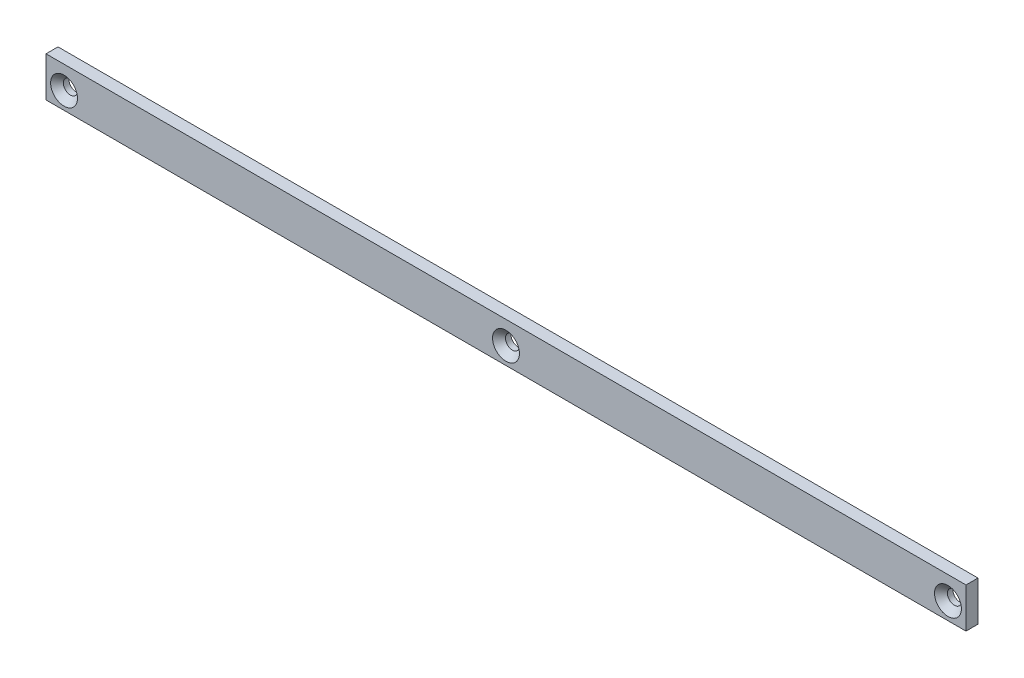
ISO-10303-21;
HEADER;
FILE_DESCRIPTION(('STEP AP214'),'2;1');
FILE_NAME('part.step','',(''),(''),'','','');
FILE_SCHEMA(('AUTOMOTIVE_DESIGN { 1 0 10303 214 1 1 1 1 }'));
ENDSEC;
DATA;
#1=APPLICATION_CONTEXT('core data for automotive mechanical design processes');
#2=APPLICATION_PROTOCOL_DEFINITION('international standard','automotive_design',2000,#1);
#3=PRODUCT_CONTEXT('',#1,'mechanical');
#4=PRODUCT('Part','Part','',(#3));
#5=PRODUCT_RELATED_PRODUCT_CATEGORY('part','',(#4));
#6=PRODUCT_DEFINITION_FORMATION('','',#4);
#7=PRODUCT_DEFINITION_CONTEXT('part definition',#1,'design');
#8=PRODUCT_DEFINITION('design','',#6,#7);
#9=PRODUCT_DEFINITION_SHAPE('','',#8);
#10=(LENGTH_UNIT() NAMED_UNIT(*) SI_UNIT(.MILLI.,.METRE.));
#11=(NAMED_UNIT(*) PLANE_ANGLE_UNIT() SI_UNIT($,.RADIAN.));
#12=(NAMED_UNIT(*) SI_UNIT($,.STERADIAN.) SOLID_ANGLE_UNIT());
#13=UNCERTAINTY_MEASURE_WITH_UNIT(LENGTH_MEASURE(1.E-05),#10,'distance_accuracy_value','');
#14=(GEOMETRIC_REPRESENTATION_CONTEXT(3) GLOBAL_UNCERTAINTY_ASSIGNED_CONTEXT((#13)) GLOBAL_UNIT_ASSIGNED_CONTEXT((#10,
#11,#12)) REPRESENTATION_CONTEXT('',''));
#15=CARTESIAN_POINT('',(0.,0.,0.));
#16=DIRECTION('',(0.,0.,1.));
#17=DIRECTION('',(1.,0.,0.));
#18=AXIS2_PLACEMENT_3D('',#15,#16,#17);
#19=CARTESIAN_POINT('',(0.,0.,3.));
#20=DIRECTION('',(0.,0.,1.));
#21=DIRECTION('',(1.,0.,0.));
#22=AXIS2_PLACEMENT_3D('',#19,#20,#21);
#23=PLANE('',#22);
#24=CARTESIAN_POINT('',(-110.490700250828,4.27927680731129,3.));
#25=DIRECTION('',(0.,0.,1.));
#26=DIRECTION('',(1.,0.,0.));
#27=AXIS2_PLACEMENT_3D('',#24,#25,#26);
#28=CIRCLE('',#27,3.36);
#29=CARTESIAN_POINT('',(-107.130700250828,4.27927680731129,3.));
#30=VERTEX_POINT('',#29);
#31=EDGE_CURVE('E192',#30,#30,#28,.T.);
#32=ORIENTED_EDGE('',*,*,#31,.F.);
#33=EDGE_LOOP('',(#32));
#34=FACE_BOUND('',#33,.T.);
#35=CARTESIAN_POINT('',(0.,4.27927680731129,3.));
#36=DIRECTION('',(0.,0.,1.));
#37=DIRECTION('',(1.,0.,0.));
#38=AXIS2_PLACEMENT_3D('',#35,#36,#37);
#39=CIRCLE('',#38,3.36);
#40=CARTESIAN_POINT('',(3.36,4.27927680731129,3.));
#41=VERTEX_POINT('',#40);
#42=EDGE_CURVE('E179',#41,#41,#39,.T.);
#43=ORIENTED_EDGE('',*,*,#42,.F.);
#44=EDGE_LOOP('',(#43));
#45=FACE_BOUND('',#44,.T.);
#46=CARTESIAN_POINT('',(110.490700250828,4.27927680731129,3.));
#47=DIRECTION('',(0.,0.,1.));
#48=DIRECTION('',(1.,0.,0.));
#49=AXIS2_PLACEMENT_3D('',#46,#47,#48);
#50=CIRCLE('',#49,3.36);
#51=CARTESIAN_POINT('',(113.850700250828,4.27927680731129,3.));
#52=VERTEX_POINT('',#51);
#53=EDGE_CURVE('E175',#52,#52,#50,.T.);
#54=ORIENTED_EDGE('',*,*,#53,.F.);
#55=EDGE_LOOP('',(#54));
#56=FACE_BOUND('',#55,.T.);
#57=DIRECTION('',(0.,1.,0.));
#58=VECTOR('',#57,1.);
#59=CARTESIAN_POINT('',(115.,0.,3.));
#60=LINE('',#59,#58);
#61=CARTESIAN_POINT('',(115.,0.,3.));
#62=VERTEX_POINT('',#61);
#63=CARTESIAN_POINT('',(115.,10.,3.));
#64=VERTEX_POINT('',#63);
#65=EDGE_CURVE('E135',#62,#64,#60,.T.);
#66=ORIENTED_EDGE('',*,*,#65,.T.);
#67=DIRECTION('',(-1.,0.,0.));
#68=VECTOR('',#67,1.);
#69=CARTESIAN_POINT('',(115.,10.,3.));
#70=LINE('',#69,#68);
#71=CARTESIAN_POINT('',(-115.,10.,3.));
#72=VERTEX_POINT('',#71);
#73=EDGE_CURVE('E128',#64,#72,#70,.T.);
#74=ORIENTED_EDGE('',*,*,#73,.T.);
#75=DIRECTION('',(0.,1.,0.));
#76=VECTOR('',#75,1.);
#77=CARTESIAN_POINT('',(-115.,0.,3.));
#78=LINE('',#77,#76);
#79=CARTESIAN_POINT('',(-115.,0.,3.));
#80=VERTEX_POINT('',#79);
#81=EDGE_CURVE('E134',#80,#72,#78,.T.);
#82=ORIENTED_EDGE('',*,*,#81,.F.);
#83=DIRECTION('',(-1.,0.,0.));
#84=VECTOR('',#83,1.);
#85=CARTESIAN_POINT('',(115.,0.,3.));
#86=LINE('',#85,#84);
#87=EDGE_CURVE('E148',#62,#80,#86,.T.);
#88=ORIENTED_EDGE('',*,*,#87,.F.);
#89=EDGE_LOOP('',(#66,#74,#82,#88));
#90=FACE_BOUND('',#89,.T.);
#91=ADVANCED_FACE('F83',(#34,#45,#56,#90),#23,.T.);
#92=CARTESIAN_POINT('',(0.,0.,0.));
#93=DIRECTION('',(0.,0.,1.));
#94=DIRECTION('',(1.,0.,0.));
#95=AXIS2_PLACEMENT_3D('',#92,#93,#94);
#96=PLANE('',#95);
#97=DIRECTION('',(0.,1.,0.));
#98=VECTOR('',#97,1.);
#99=CARTESIAN_POINT('',(115.,0.,0.));
#100=LINE('',#99,#98);
#101=CARTESIAN_POINT('',(115.,0.,0.));
#102=VERTEX_POINT('',#101);
#103=CARTESIAN_POINT('',(115.,10.,0.));
#104=VERTEX_POINT('',#103);
#105=EDGE_CURVE('E154',#102,#104,#100,.T.);
#106=ORIENTED_EDGE('',*,*,#105,.F.);
#107=DIRECTION('',(-1.,0.,0.));
#108=VECTOR('',#107,1.);
#109=CARTESIAN_POINT('',(115.,0.,0.));
#110=LINE('',#109,#108);
#111=CARTESIAN_POINT('',(-115.,0.,0.));
#112=VERTEX_POINT('',#111);
#113=EDGE_CURVE('E163',#102,#112,#110,.T.);
#114=ORIENTED_EDGE('',*,*,#113,.T.);
#115=DIRECTION('',(0.,1.,0.));
#116=VECTOR('',#115,1.);
#117=CARTESIAN_POINT('',(-115.,0.,0.));
#118=LINE('',#117,#116);
#119=CARTESIAN_POINT('',(-115.,10.,0.));
#120=VERTEX_POINT('',#119);
#121=EDGE_CURVE('E160',#112,#120,#118,.T.);
#122=ORIENTED_EDGE('',*,*,#121,.T.);
#123=DIRECTION('',(-1.,0.,0.));
#124=VECTOR('',#123,1.);
#125=CARTESIAN_POINT('',(115.,10.,0.));
#126=LINE('',#125,#124);
#127=EDGE_CURVE('E141',#104,#120,#126,.T.);
#128=ORIENTED_EDGE('',*,*,#127,.F.);
#129=EDGE_LOOP('',(#106,#114,#122,#128));
#130=FACE_BOUND('',#129,.T.);
#131=CARTESIAN_POINT('',(110.490700250828,4.27927680731129,0.));
#132=DIRECTION('',(0.,0.,1.));
#133=DIRECTION('',(1.,0.,0.));
#134=AXIS2_PLACEMENT_3D('',#131,#132,#133);
#135=CIRCLE('',#134,1.75);
#136=CARTESIAN_POINT('',(112.240700250828,4.27927680731129,0.));
#137=VERTEX_POINT('',#136);
#138=EDGE_CURVE('E157',#137,#137,#135,.T.);
#139=ORIENTED_EDGE('',*,*,#138,.T.);
#140=EDGE_LOOP('',(#139));
#141=FACE_BOUND('',#140,.T.);
#142=CARTESIAN_POINT('',(0.,4.27927680731129,0.));
#143=DIRECTION('',(0.,0.,1.));
#144=DIRECTION('',(1.,0.,0.));
#145=AXIS2_PLACEMENT_3D('',#142,#143,#144);
#146=CIRCLE('',#145,1.75);
#147=CARTESIAN_POINT('',(1.75,4.27927680731129,0.));
#148=VERTEX_POINT('',#147);
#149=EDGE_CURVE('E198',#148,#148,#146,.T.);
#150=ORIENTED_EDGE('',*,*,#149,.T.);
#151=EDGE_LOOP('',(#150));
#152=FACE_BOUND('',#151,.T.);
#153=CARTESIAN_POINT('',(-110.490700250828,4.27927680731129,0.));
#154=DIRECTION('',(0.,0.,1.));
#155=DIRECTION('',(1.,0.,0.));
#156=AXIS2_PLACEMENT_3D('',#153,#154,#155);
#157=CIRCLE('',#156,1.76884275115743);
#158=CARTESIAN_POINT('',(-108.72185749967,4.27927680731129,0.));
#159=VERTEX_POINT('',#158);
#160=EDGE_CURVE('E174',#159,#159,#157,.T.);
#161=ORIENTED_EDGE('',*,*,#160,.T.);
#162=EDGE_LOOP('',(#161));
#163=FACE_BOUND('',#162,.T.);
#164=ADVANCED_FACE('F207',(#130,#141,#152,#163),#96,.F.);
#165=CARTESIAN_POINT('',(115.,0.,3.));
#166=DIRECTION('',(-1.,0.,0.));
#167=DIRECTION('',(0.,0.,1.));
#168=AXIS2_PLACEMENT_3D('',#165,#166,#167);
#169=PLANE('',#168);
#170=ORIENTED_EDGE('',*,*,#105,.T.);
#171=DIRECTION('',(0.,0.,-1.));
#172=VECTOR('',#171,1.);
#173=CARTESIAN_POINT('',(115.,10.,3.));
#174=LINE('',#173,#172);
#175=EDGE_CURVE('E12',#64,#104,#174,.T.);
#176=ORIENTED_EDGE('',*,*,#175,.F.);
#177=ORIENTED_EDGE('',*,*,#65,.F.);
#178=DIRECTION('',(0.,0.,-1.));
#179=VECTOR('',#178,1.);
#180=CARTESIAN_POINT('',(115.,0.,3.));
#181=LINE('',#180,#179);
#182=EDGE_CURVE('E103',#62,#102,#181,.T.);
#183=ORIENTED_EDGE('',*,*,#182,.T.);
#184=EDGE_LOOP('',(#170,#176,#177,#183));
#185=FACE_BOUND('',#184,.T.);
#186=ADVANCED_FACE('F85',(#185),#169,.F.);
#187=CARTESIAN_POINT('',(115.,10.,3.));
#188=DIRECTION('',(0.,-1.,0.));
#189=DIRECTION('',(0.,0.,-1.));
#190=AXIS2_PLACEMENT_3D('',#187,#188,#189);
#191=PLANE('',#190);
#192=ORIENTED_EDGE('',*,*,#127,.T.);
#193=DIRECTION('',(0.,0.,-1.));
#194=VECTOR('',#193,1.);
#195=CARTESIAN_POINT('',(-115.,10.,3.));
#196=LINE('',#195,#194);
#197=EDGE_CURVE('E94',#72,#120,#196,.T.);
#198=ORIENTED_EDGE('',*,*,#197,.F.);
#199=ORIENTED_EDGE('',*,*,#73,.F.);
#200=ORIENTED_EDGE('',*,*,#175,.T.);
#201=EDGE_LOOP('',(#192,#198,#199,#200));
#202=FACE_BOUND('',#201,.T.);
#203=ADVANCED_FACE('F140',(#202),#191,.F.);
#204=CARTESIAN_POINT('',(-115.,0.,3.));
#205=DIRECTION('',(-1.,0.,0.));
#206=DIRECTION('',(0.,0.,1.));
#207=AXIS2_PLACEMENT_3D('',#204,#205,#206);
#208=PLANE('',#207);
#209=ORIENTED_EDGE('',*,*,#121,.F.);
#210=DIRECTION('',(0.,0.,-1.));
#211=VECTOR('',#210,1.);
#212=CARTESIAN_POINT('',(-115.,0.,3.));
#213=LINE('',#212,#211);
#214=EDGE_CURVE('E117',#80,#112,#213,.T.);
#215=ORIENTED_EDGE('',*,*,#214,.F.);
#216=ORIENTED_EDGE('',*,*,#81,.T.);
#217=ORIENTED_EDGE('',*,*,#197,.T.);
#218=EDGE_LOOP('',(#209,#215,#216,#217));
#219=FACE_BOUND('',#218,.T.);
#220=ADVANCED_FACE('F146',(#219),#208,.T.);
#221=CARTESIAN_POINT('',(115.,0.,3.));
#222=DIRECTION('',(0.,-1.,0.));
#223=DIRECTION('',(0.,0.,-1.));
#224=AXIS2_PLACEMENT_3D('',#221,#222,#223);
#225=PLANE('',#224);
#226=ORIENTED_EDGE('',*,*,#113,.F.);
#227=ORIENTED_EDGE('',*,*,#182,.F.);
#228=ORIENTED_EDGE('',*,*,#87,.T.);
#229=ORIENTED_EDGE('',*,*,#214,.T.);
#230=EDGE_LOOP('',(#226,#227,#228,#229));
#231=FACE_BOUND('',#230,.T.);
#232=ADVANCED_FACE('F213',(#231),#225,.T.);
#233=CARTESIAN_POINT('',(110.490700250828,4.27927680731129,3.));
#234=DIRECTION('',(0.,0.,-1.));
#235=DIRECTION('',(-1.,0.,0.));
#236=AXIS2_PLACEMENT_3D('',#233,#234,#235);
#237=CYLINDRICAL_SURFACE('',#236,1.75);
#238=CARTESIAN_POINT('',(110.490700250828,4.27927680731129,1.38999999999998));
#239=DIRECTION('',(0.,0.,1.));
#240=DIRECTION('',(1.,0.,0.));
#241=AXIS2_PLACEMENT_3D('',#238,#239,#240);
#242=CIRCLE('',#241,1.75);
#243=CARTESIAN_POINT('',(112.240700250828,4.27927680731129,1.38999999999998));
#244=VERTEX_POINT('',#243);
#245=EDGE_CURVE('E171',#244,#244,#242,.F.);
#246=ORIENTED_EDGE('',*,*,#245,.F.);
#247=EDGE_LOOP('',(#246));
#248=FACE_BOUND('',#247,.T.);
#249=ORIENTED_EDGE('',*,*,#138,.F.);
#250=EDGE_LOOP('',(#249));
#251=FACE_BOUND('',#250,.T.);
#252=ADVANCED_FACE('F210',(#248,#251),#237,.F.);
#253=CARTESIAN_POINT('',(0.,4.27927680731129,3.));
#254=DIRECTION('',(0.,0.,-1.));
#255=DIRECTION('',(-1.,0.,0.));
#256=AXIS2_PLACEMENT_3D('',#253,#254,#255);
#257=CYLINDRICAL_SURFACE('',#256,1.75);
#258=CARTESIAN_POINT('',(0.,4.27927680731129,1.38999999999999));
#259=DIRECTION('',(0.,0.,1.));
#260=DIRECTION('',(1.,0.,0.));
#261=AXIS2_PLACEMENT_3D('',#258,#259,#260);
#262=CIRCLE('',#261,1.75);
#263=CARTESIAN_POINT('',(1.75,4.27927680731129,1.38999999999999));
#264=VERTEX_POINT('',#263);
#265=EDGE_CURVE('E176',#264,#264,#262,.F.);
#266=ORIENTED_EDGE('',*,*,#265,.F.);
#267=EDGE_LOOP('',(#266));
#268=FACE_BOUND('',#267,.T.);
#269=ORIENTED_EDGE('',*,*,#149,.F.);
#270=EDGE_LOOP('',(#269));
#271=FACE_BOUND('',#270,.T.);
#272=ADVANCED_FACE('F212',(#268,#271),#257,.F.);
#273=CARTESIAN_POINT('',(-110.490700250828,4.27927680731129,3.));
#274=DIRECTION('',(0.,0.,-1.));
#275=DIRECTION('',(-1.,0.,0.));
#276=AXIS2_PLACEMENT_3D('',#273,#274,#275);
#277=CYLINDRICAL_SURFACE('',#276,1.76884275115743);
#278=CARTESIAN_POINT('',(-110.490700250828,4.27927680731129,1.40884275115742));
#279=DIRECTION('',(0.,0.,1.));
#280=DIRECTION('',(1.,0.,0.));
#281=AXIS2_PLACEMENT_3D('',#278,#279,#280);
#282=CIRCLE('',#281,1.76884275115743);
#283=CARTESIAN_POINT('',(-108.72185749967,4.27927680731129,1.40884275115742));
#284=VERTEX_POINT('',#283);
#285=EDGE_CURVE('E87',#284,#284,#282,.F.);
#286=ORIENTED_EDGE('',*,*,#285,.F.);
#287=EDGE_LOOP('',(#286));
#288=FACE_BOUND('',#287,.T.);
#289=ORIENTED_EDGE('',*,*,#160,.F.);
#290=EDGE_LOOP('',(#289));
#291=FACE_BOUND('',#290,.T.);
#292=ADVANCED_FACE('F220',(#288,#291),#277,.F.);
#293=CARTESIAN_POINT('',(110.490700250828,4.27927680731129,3.));
#294=DIRECTION('',(0.,0.,1.));
#295=DIRECTION('',(1.,0.,0.));
#296=AXIS2_PLACEMENT_3D('',#293,#294,#295);
#297=CONICAL_SURFACE('',#296,3.36,0.785398163397444);
#298=ORIENTED_EDGE('',*,*,#245,.T.);
#299=EDGE_LOOP('',(#298));
#300=FACE_BOUND('',#299,.T.);
#301=ORIENTED_EDGE('',*,*,#53,.T.);
#302=EDGE_LOOP('',(#301));
#303=FACE_BOUND('',#302,.T.);
#304=ADVANCED_FACE('F286',(#300,#303),#297,.F.);
#305=CARTESIAN_POINT('',(0.,4.27927680731129,3.));
#306=DIRECTION('',(0.,0.,1.));
#307=DIRECTION('',(1.,0.,0.));
#308=AXIS2_PLACEMENT_3D('',#305,#306,#307);
#309=CONICAL_SURFACE('',#308,3.36,0.785398163397445);
#310=ORIENTED_EDGE('',*,*,#265,.T.);
#311=EDGE_LOOP('',(#310));
#312=FACE_BOUND('',#311,.T.);
#313=ORIENTED_EDGE('',*,*,#42,.T.);
#314=EDGE_LOOP('',(#313));
#315=FACE_BOUND('',#314,.T.);
#316=ADVANCED_FACE('F295',(#312,#315),#309,.F.);
#317=CARTESIAN_POINT('',(-110.490700250828,4.27927680731129,3.));
#318=DIRECTION('',(0.,0.,1.));
#319=DIRECTION('',(1.,0.,0.));
#320=AXIS2_PLACEMENT_3D('',#317,#318,#319);
#321=CONICAL_SURFACE('',#320,3.36,0.785398163397444);
#322=ORIENTED_EDGE('',*,*,#285,.T.);
#323=EDGE_LOOP('',(#322));
#324=FACE_BOUND('',#323,.T.);
#325=ORIENTED_EDGE('',*,*,#31,.T.);
#326=EDGE_LOOP('',(#325));
#327=FACE_BOUND('',#326,.T.);
#328=ADVANCED_FACE('F304',(#324,#327),#321,.F.);
#329=CLOSED_SHELL('',(#91,#164,#186,#203,#220,#232,#252,#272,#292,#304,#316,#328));
#330=MANIFOLD_SOLID_BREP('B2',#329);
#331=ADVANCED_BREP_SHAPE_REPRESENTATION('',(#18,#330),#14);
#332=SHAPE_DEFINITION_REPRESENTATION(#9,#331);
ENDSEC;
END-ISO-10303-21;
